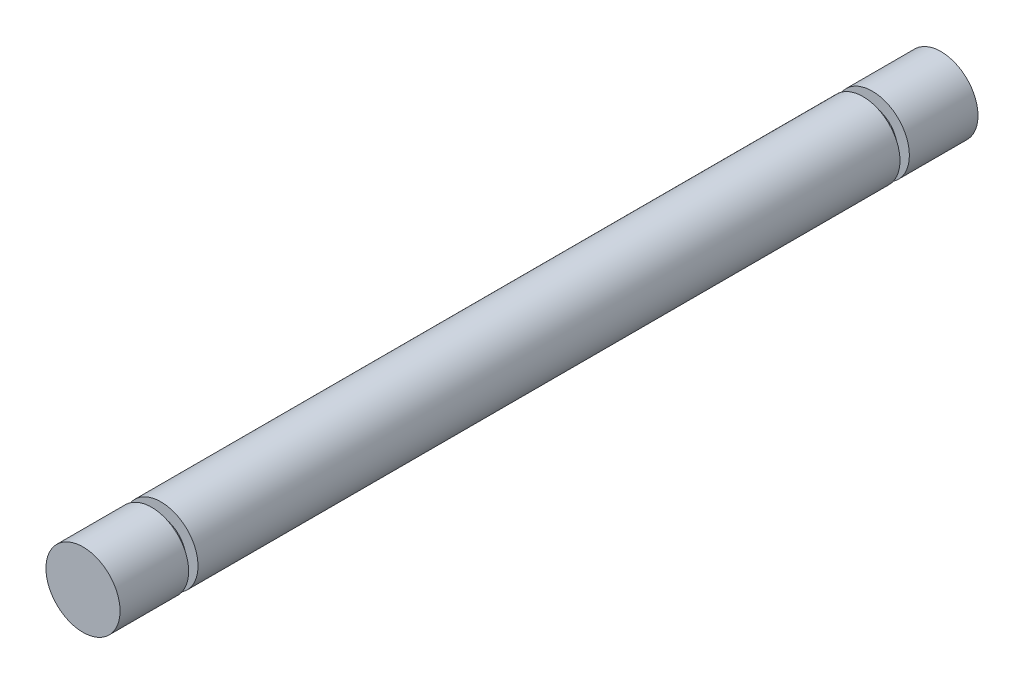
ISO-10303-21;
HEADER;
FILE_DESCRIPTION(('STEP AP214'),'2;1');
FILE_NAME('part.step','',(''),(''),'','','');
FILE_SCHEMA(('AUTOMOTIVE_DESIGN { 1 0 10303 214 1 1 1 1 }'));
ENDSEC;
DATA;
#1=APPLICATION_CONTEXT('core data for automotive mechanical design processes');
#2=APPLICATION_PROTOCOL_DEFINITION('international standard','automotive_design',2000,#1);
#3=PRODUCT_CONTEXT('',#1,'mechanical');
#4=PRODUCT('Part','Part','',(#3));
#5=PRODUCT_RELATED_PRODUCT_CATEGORY('part','',(#4));
#6=PRODUCT_DEFINITION_FORMATION('','',#4);
#7=PRODUCT_DEFINITION_CONTEXT('part definition',#1,'design');
#8=PRODUCT_DEFINITION('design','',#6,#7);
#9=PRODUCT_DEFINITION_SHAPE('','',#8);
#10=(LENGTH_UNIT() NAMED_UNIT(*) SI_UNIT(.MILLI.,.METRE.));
#11=(NAMED_UNIT(*) PLANE_ANGLE_UNIT() SI_UNIT($,.RADIAN.));
#12=(NAMED_UNIT(*) SI_UNIT($,.STERADIAN.) SOLID_ANGLE_UNIT());
#13=UNCERTAINTY_MEASURE_WITH_UNIT(LENGTH_MEASURE(1.E-05),#10,'distance_accuracy_value','');
#14=(GEOMETRIC_REPRESENTATION_CONTEXT(3) GLOBAL_UNCERTAINTY_ASSIGNED_CONTEXT((#13)) GLOBAL_UNIT_ASSIGNED_CONTEXT((#10,
#11,#12)) REPRESENTATION_CONTEXT('',''));
#15=CARTESIAN_POINT('',(0.,0.,0.));
#16=DIRECTION('',(0.,0.,1.));
#17=DIRECTION('',(1.,0.,0.));
#18=AXIS2_PLACEMENT_3D('',#15,#16,#17);
#19=CARTESIAN_POINT('',(0.,0.,22.5));
#20=DIRECTION('',(0.,0.,-1.));
#21=DIRECTION('',(-1.,0.,0.));
#22=AXIS2_PLACEMENT_3D('',#19,#20,#21);
#23=CYLINDRICAL_SURFACE('',#22,2.375);
#24=CARTESIAN_POINT('',(0.,0.,22.5));
#25=DIRECTION('',(0.,0.,1.));
#26=DIRECTION('',(1.,0.,0.));
#27=AXIS2_PLACEMENT_3D('',#24,#25,#26);
#28=CIRCLE('',#27,2.375);
#29=CARTESIAN_POINT('',(-2.375,0.,22.5));
#30=VERTEX_POINT('',#29);
#31=EDGE_CURVE('E46',#30,#30,#28,.T.);
#32=CARTESIAN_POINT('',(0.,0.,-22.5));
#33=DIRECTION('',(0.,0.,1.));
#34=DIRECTION('',(1.,0.,0.));
#35=AXIS2_PLACEMENT_3D('',#32,#33,#34);
#36=CIRCLE('',#35,2.375);
#37=CARTESIAN_POINT('',(-2.375,0.,-22.5));
#38=VERTEX_POINT('',#37);
#39=EDGE_CURVE('E65',#38,#38,#36,.T.);
#40=CARTESIAN_POINT('',(-2.375,0.,22.5));
#41=CARTESIAN_POINT('',(-2.375,0.,22.03125));
#42=CARTESIAN_POINT('',(-2.375,0.,21.5625));
#43=CARTESIAN_POINT('',(-2.375,0.,20.625));
#44=CARTESIAN_POINT('',(-2.375,0.,20.15625));
#45=CARTESIAN_POINT('',(-2.375,0.,19.21875));
#46=CARTESIAN_POINT('',(-2.375,0.,18.75));
#47=CARTESIAN_POINT('',(-2.375,0.,17.8125));
#48=CARTESIAN_POINT('',(-2.375,0.,17.34375));
#49=CARTESIAN_POINT('',(-2.375,0.,16.40625));
#50=CARTESIAN_POINT('',(-2.375,0.,15.9375));
#51=CARTESIAN_POINT('',(-2.375,0.,15.));
#52=CARTESIAN_POINT('',(-2.375,0.,14.53125));
#53=CARTESIAN_POINT('',(-2.375,0.,13.59375));
#54=CARTESIAN_POINT('',(-2.375,0.,13.125));
#55=CARTESIAN_POINT('',(-2.375,0.,12.1875));
#56=CARTESIAN_POINT('',(-2.375,0.,11.71875));
#57=CARTESIAN_POINT('',(-2.375,0.,10.78125));
#58=CARTESIAN_POINT('',(-2.375,0.,10.3125));
#59=CARTESIAN_POINT('',(-2.375,0.,9.37499999999999));
#60=CARTESIAN_POINT('',(-2.375,0.,8.90625));
#61=CARTESIAN_POINT('',(-2.375,0.,7.96874999999999));
#62=CARTESIAN_POINT('',(-2.375,0.,7.5));
#63=CARTESIAN_POINT('',(-2.375,0.,6.5625));
#64=CARTESIAN_POINT('',(-2.375,0.,6.09375));
#65=CARTESIAN_POINT('',(-2.375,0.,5.15625));
#66=CARTESIAN_POINT('',(-2.375,0.,4.6875));
#67=CARTESIAN_POINT('',(-2.375,0.,3.75));
#68=CARTESIAN_POINT('',(-2.375,0.,3.28125));
#69=CARTESIAN_POINT('',(-2.375,0.,2.34375));
#70=CARTESIAN_POINT('',(-2.375,0.,1.875));
#71=CARTESIAN_POINT('',(-2.375,0.,0.937499999999997));
#72=CARTESIAN_POINT('',(-2.375,0.,0.468749999999997));
#73=CARTESIAN_POINT('',(-2.375,0.,-0.468750000000004));
#74=CARTESIAN_POINT('',(-2.375,0.,-0.937500000000004));
#75=CARTESIAN_POINT('',(-2.375,0.,-1.87500000000001));
#76=CARTESIAN_POINT('',(-2.375,0.,-2.34375000000001));
#77=CARTESIAN_POINT('',(-2.375,0.,-3.28125));
#78=CARTESIAN_POINT('',(-2.375,0.,-3.75));
#79=CARTESIAN_POINT('',(-2.375,0.,-4.6875));
#80=CARTESIAN_POINT('',(-2.375,0.,-5.15625));
#81=CARTESIAN_POINT('',(-2.375,0.,-6.09375000000001));
#82=CARTESIAN_POINT('',(-2.375,0.,-6.56250000000001));
#83=CARTESIAN_POINT('',(-2.375,0.,-7.50000000000001));
#84=CARTESIAN_POINT('',(-2.375,0.,-7.96875000000001));
#85=CARTESIAN_POINT('',(-2.375,0.,-8.90625));
#86=CARTESIAN_POINT('',(-2.375,0.,-9.37500000000001));
#87=CARTESIAN_POINT('',(-2.375,0.,-10.3125));
#88=CARTESIAN_POINT('',(-2.375,0.,-10.78125));
#89=CARTESIAN_POINT('',(-2.375,0.,-11.71875));
#90=CARTESIAN_POINT('',(-2.375,0.,-12.1875));
#91=CARTESIAN_POINT('',(-2.375,0.,-13.125));
#92=CARTESIAN_POINT('',(-2.375,0.,-13.59375));
#93=CARTESIAN_POINT('',(-2.375,0.,-14.53125));
#94=CARTESIAN_POINT('',(-2.375,0.,-15.));
#95=CARTESIAN_POINT('',(-2.375,0.,-15.9375));
#96=CARTESIAN_POINT('',(-2.375,0.,-16.40625));
#97=CARTESIAN_POINT('',(-2.375,0.,-17.34375));
#98=CARTESIAN_POINT('',(-2.375,0.,-17.8125));
#99=CARTESIAN_POINT('',(-2.375,0.,-18.75));
#100=CARTESIAN_POINT('',(-2.375,0.,-19.21875));
#101=CARTESIAN_POINT('',(-2.375,0.,-20.15625));
#102=CARTESIAN_POINT('',(-2.375,0.,-20.625));
#103=CARTESIAN_POINT('',(-2.375,0.,-21.5625));
#104=CARTESIAN_POINT('',(-2.375,0.,-22.03125));
#105=CARTESIAN_POINT('',(-2.375,0.,-22.5));
#106=B_SPLINE_CURVE_WITH_KNOTS('',3,(#40,#41,#42,#43,#44,#45,#46,#47,#48,#49,#50,#51,#52,#53,
#54,#55,#56,#57,#58,#59,#60,#61,#62,#63,#64,#65,#66,#67,#68,#69,#70,#71,#72,#73,#74,#75,#76,#77,
#78,#79,#80,#81,#82,#83,#84,#85,#86,#87,#88,#89,#90,#91,#92,#93,#94,#95,#96,#97,#98,#99,#100,
#101,#102,#103,#104,#105),.UNSPECIFIED.,.F.,.F.,(4,2,2,2,2,2,2,2,2,2,2,2,2,2,2,2,2,2,2,2,2,2,2,
2,2,2,2,2,2,2,2,2,4),(0.,1.40625,2.8125,4.21875,5.625,7.03125,8.4375,9.84375,11.25,12.65625,
14.0625,15.46875,16.875,18.28125,19.6875,21.09375,22.5,23.90625,25.3125,26.71875,28.125,
29.53125,30.9375,32.34375,33.75,35.15625,36.5625,37.96875,39.375,40.78125,42.1875,43.59375,45.),.UNSPECIFIED.);
#107=EDGE_CURVE('BSEAM43',#30,#38,#106,.T.);
#108=ORIENTED_EDGE('',*,*,#31,.F.);
#109=ORIENTED_EDGE('',*,*,#39,.T.);
#110=ORIENTED_EDGE('',*,*,#107,.T.);
#111=ORIENTED_EDGE('',*,*,#107,.F.);
#112=EDGE_LOOP('',(#108,#110,#109,#111));
#113=FACE_BOUND('',#112,.T.);
#114=ADVANCED_FACE('F43',(#113),#23,.T.);
#115=CARTESIAN_POINT('',(0.,0.,22.5));
#116=DIRECTION('',(0.,0.,1.));
#117=DIRECTION('',(1.,0.,0.));
#118=AXIS2_PLACEMENT_3D('',#115,#116,#117);
#119=PLANE('',#118);
#120=CARTESIAN_POINT('',(0.,0.,22.5));
#121=DIRECTION('',(0.,0.,1.));
#122=DIRECTION('',(1.,0.,0.));
#123=AXIS2_PLACEMENT_3D('',#120,#121,#122);
#124=CIRCLE('',#123,1.6);
#125=CARTESIAN_POINT('',(1.6,0.,22.5));
#126=VERTEX_POINT('',#125);
#127=EDGE_CURVE('E10',#126,#126,#124,.T.);
#128=ORIENTED_EDGE('',*,*,#127,.F.);
#129=EDGE_LOOP('',(#128));
#130=FACE_BOUND('',#129,.T.);
#131=ORIENTED_EDGE('',*,*,#31,.T.);
#132=EDGE_LOOP('',(#131));
#133=FACE_BOUND('',#132,.T.);
#134=ADVANCED_FACE('F105',(#130,#133),#119,.T.);
#135=CARTESIAN_POINT('',(0.,0.,23.1));
#136=DIRECTION('',(0.,0.,-1.));
#137=DIRECTION('',(-1.,0.,0.));
#138=AXIS2_PLACEMENT_3D('',#135,#136,#137);
#139=CYLINDRICAL_SURFACE('',#138,1.6);
#140=CARTESIAN_POINT('',(0.,0.,23.1));
#141=DIRECTION('',(0.,0.,1.));
#142=DIRECTION('',(1.,0.,0.));
#143=AXIS2_PLACEMENT_3D('',#140,#141,#142);
#144=CIRCLE('',#143,1.6);
#145=CARTESIAN_POINT('',(1.6,0.,23.1));
#146=VERTEX_POINT('',#145);
#147=EDGE_CURVE('E55',#146,#146,#144,.T.);
#148=ORIENTED_EDGE('',*,*,#147,.F.);
#149=EDGE_LOOP('',(#148));
#150=FACE_BOUND('',#149,.T.);
#151=ORIENTED_EDGE('',*,*,#127,.T.);
#152=EDGE_LOOP('',(#151));
#153=FACE_BOUND('',#152,.T.);
#154=ADVANCED_FACE('F112',(#150,#153),#139,.T.);
#155=CARTESIAN_POINT('',(0.,0.,27.5));
#156=DIRECTION('',(0.,0.,-1.));
#157=DIRECTION('',(-1.,0.,0.));
#158=AXIS2_PLACEMENT_3D('',#155,#156,#157);
#159=CYLINDRICAL_SURFACE('',#158,2.375);
#160=CARTESIAN_POINT('',(0.,0.,27.5));
#161=DIRECTION('',(0.,0.,1.));
#162=DIRECTION('',(1.,0.,0.));
#163=AXIS2_PLACEMENT_3D('',#160,#161,#162);
#164=CIRCLE('',#163,2.375);
#165=CARTESIAN_POINT('',(2.375,0.,27.5));
#166=VERTEX_POINT('',#165);
#167=EDGE_CURVE('E60',#166,#166,#164,.T.);
#168=ORIENTED_EDGE('',*,*,#167,.F.);
#169=EDGE_LOOP('',(#168));
#170=FACE_BOUND('',#169,.T.);
#171=CARTESIAN_POINT('',(0.,0.,23.1));
#172=DIRECTION('',(0.,0.,1.));
#173=DIRECTION('',(1.,0.,0.));
#174=AXIS2_PLACEMENT_3D('',#171,#172,#173);
#175=CIRCLE('',#174,2.375);
#176=CARTESIAN_POINT('',(2.375,0.,23.1));
#177=VERTEX_POINT('',#176);
#178=EDGE_CURVE('E61',#177,#177,#175,.T.);
#179=ORIENTED_EDGE('',*,*,#178,.T.);
#180=EDGE_LOOP('',(#179));
#181=FACE_BOUND('',#180,.T.);
#182=ADVANCED_FACE('F132',(#170,#181),#159,.T.);
#183=CARTESIAN_POINT('',(0.,0.,27.5));
#184=DIRECTION('',(0.,0.,1.));
#185=DIRECTION('',(1.,0.,0.));
#186=AXIS2_PLACEMENT_3D('',#183,#184,#185);
#187=PLANE('',#186);
#188=ORIENTED_EDGE('',*,*,#167,.T.);
#189=EDGE_LOOP('',(#188));
#190=FACE_BOUND('',#189,.T.);
#191=ADVANCED_FACE('F127',(#190),#187,.T.);
#192=CARTESIAN_POINT('',(0.,0.,23.1));
#193=DIRECTION('',(0.,0.,1.));
#194=DIRECTION('',(1.,0.,0.));
#195=AXIS2_PLACEMENT_3D('',#192,#193,#194);
#196=PLANE('',#195);
#197=ORIENTED_EDGE('',*,*,#147,.T.);
#198=EDGE_LOOP('',(#197));
#199=FACE_BOUND('',#198,.T.);
#200=ORIENTED_EDGE('',*,*,#178,.F.);
#201=EDGE_LOOP('',(#200));
#202=FACE_BOUND('',#201,.T.);
#203=ADVANCED_FACE('F119',(#199,#202),#196,.F.);
#204=CARTESIAN_POINT('',(0.,0.,-22.5));
#205=DIRECTION('',(0.,0.,-1.));
#206=DIRECTION('',(1.,0.,0.));
#207=AXIS2_PLACEMENT_3D('',#204,#205,#206);
#208=PLANE('',#207);
#209=CARTESIAN_POINT('',(0.,0.,-22.5));
#210=DIRECTION('',(0.,0.,1.));
#211=DIRECTION('',(1.,0.,0.));
#212=AXIS2_PLACEMENT_3D('',#209,#210,#211);
#213=CIRCLE('',#212,1.6);
#214=CARTESIAN_POINT('',(1.6,0.,-22.5));
#215=VERTEX_POINT('',#214);
#216=EDGE_CURVE('E72',#215,#215,#213,.T.);
#217=ORIENTED_EDGE('',*,*,#216,.T.);
#218=EDGE_LOOP('',(#217));
#219=FACE_BOUND('',#218,.T.);
#220=ORIENTED_EDGE('',*,*,#39,.F.);
#221=EDGE_LOOP('',(#220));
#222=FACE_BOUND('',#221,.T.);
#223=ADVANCED_FACE('F118',(#219,#222),#208,.T.);
#224=CARTESIAN_POINT('',(0.,0.,-23.1));
#225=DIRECTION('',(0.,0.,1.));
#226=DIRECTION('',(1.,0.,0.));
#227=AXIS2_PLACEMENT_3D('',#224,#225,#226);
#228=CYLINDRICAL_SURFACE('',#227,1.6);
#229=CARTESIAN_POINT('',(0.,0.,-23.1));
#230=DIRECTION('',(0.,0.,1.));
#231=DIRECTION('',(1.,0.,0.));
#232=AXIS2_PLACEMENT_3D('',#229,#230,#231);
#233=CIRCLE('',#232,1.6);
#234=CARTESIAN_POINT('',(1.6,0.,-23.1));
#235=VERTEX_POINT('',#234);
#236=EDGE_CURVE('E76',#235,#235,#233,.T.);
#237=ORIENTED_EDGE('',*,*,#236,.T.);
#238=EDGE_LOOP('',(#237));
#239=FACE_BOUND('',#238,.T.);
#240=ORIENTED_EDGE('',*,*,#216,.F.);
#241=EDGE_LOOP('',(#240));
#242=FACE_BOUND('',#241,.T.);
#243=ADVANCED_FACE('F102',(#239,#242),#228,.T.);
#244=CARTESIAN_POINT('',(0.,0.,-27.5));
#245=DIRECTION('',(0.,0.,1.));
#246=DIRECTION('',(1.,0.,0.));
#247=AXIS2_PLACEMENT_3D('',#244,#245,#246);
#248=CYLINDRICAL_SURFACE('',#247,2.375);
#249=CARTESIAN_POINT('',(0.,0.,-27.5));
#250=DIRECTION('',(0.,0.,1.));
#251=DIRECTION('',(1.,0.,0.));
#252=AXIS2_PLACEMENT_3D('',#249,#250,#251);
#253=CIRCLE('',#252,2.375);
#254=CARTESIAN_POINT('',(2.375,0.,-27.5));
#255=VERTEX_POINT('',#254);
#256=EDGE_CURVE('E80',#255,#255,#253,.T.);
#257=ORIENTED_EDGE('',*,*,#256,.T.);
#258=EDGE_LOOP('',(#257));
#259=FACE_BOUND('',#258,.T.);
#260=CARTESIAN_POINT('',(0.,0.,-23.1));
#261=DIRECTION('',(0.,0.,1.));
#262=DIRECTION('',(1.,0.,0.));
#263=AXIS2_PLACEMENT_3D('',#260,#261,#262);
#264=CIRCLE('',#263,2.375);
#265=CARTESIAN_POINT('',(2.375,0.,-23.1));
#266=VERTEX_POINT('',#265);
#267=EDGE_CURVE('E81',#266,#266,#264,.T.);
#268=ORIENTED_EDGE('',*,*,#267,.F.);
#269=EDGE_LOOP('',(#268));
#270=FACE_BOUND('',#269,.T.);
#271=ADVANCED_FACE('F89',(#259,#270),#248,.T.);
#272=CARTESIAN_POINT('',(0.,0.,-27.5));
#273=DIRECTION('',(0.,0.,-1.));
#274=DIRECTION('',(1.,0.,0.));
#275=AXIS2_PLACEMENT_3D('',#272,#273,#274);
#276=PLANE('',#275);
#277=ORIENTED_EDGE('',*,*,#256,.F.);
#278=EDGE_LOOP('',(#277));
#279=FACE_BOUND('',#278,.T.);
#280=ADVANCED_FACE('F92',(#279),#276,.T.);
#281=CARTESIAN_POINT('',(0.,0.,-23.1));
#282=DIRECTION('',(0.,0.,-1.));
#283=DIRECTION('',(1.,0.,0.));
#284=AXIS2_PLACEMENT_3D('',#281,#282,#283);
#285=PLANE('',#284);
#286=ORIENTED_EDGE('',*,*,#236,.F.);
#287=EDGE_LOOP('',(#286));
#288=FACE_BOUND('',#287,.T.);
#289=ORIENTED_EDGE('',*,*,#267,.T.);
#290=EDGE_LOOP('',(#289));
#291=FACE_BOUND('',#290,.T.);
#292=ADVANCED_FACE('F94',(#288,#291),#285,.F.);
#293=CLOSED_SHELL('',(#114,#134,#154,#182,#191,#203,#223,#243,#271,#280,#292));
#294=MANIFOLD_SOLID_BREP('B2',#293);
#295=ADVANCED_BREP_SHAPE_REPRESENTATION('',(#18,#294),#14);
#296=SHAPE_DEFINITION_REPRESENTATION(#9,#295);
ENDSEC;
END-ISO-10303-21;
